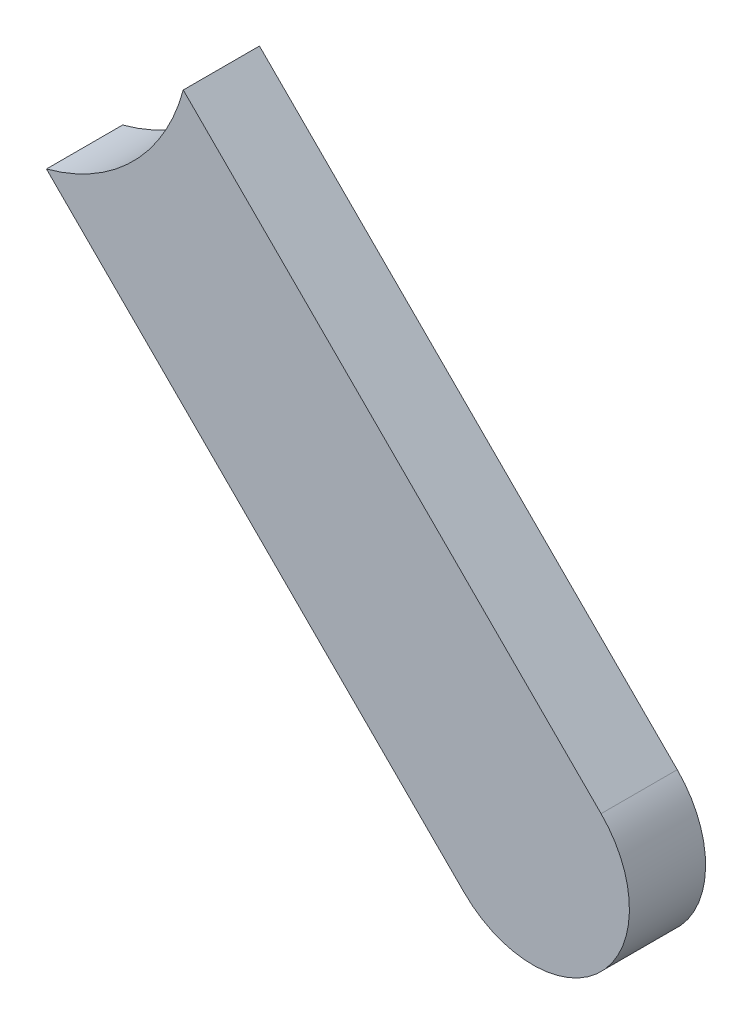
ISO-10303-21;
HEADER;
FILE_DESCRIPTION(('STEP AP214'),'2;1');
FILE_NAME('part.step','',(''),(''),'','','');
FILE_SCHEMA(('AUTOMOTIVE_DESIGN { 1 0 10303 214 1 1 1 1 }'));
ENDSEC;
DATA;
#1=APPLICATION_CONTEXT('core data for automotive mechanical design processes');
#2=APPLICATION_PROTOCOL_DEFINITION('international standard','automotive_design',2000,#1);
#3=PRODUCT_CONTEXT('',#1,'mechanical');
#4=PRODUCT('Part','Part','',(#3));
#5=PRODUCT_RELATED_PRODUCT_CATEGORY('part','',(#4));
#6=PRODUCT_DEFINITION_FORMATION('','',#4);
#7=PRODUCT_DEFINITION_CONTEXT('part definition',#1,'design');
#8=PRODUCT_DEFINITION('design','',#6,#7);
#9=PRODUCT_DEFINITION_SHAPE('','',#8);
#10=(LENGTH_UNIT() NAMED_UNIT(*) SI_UNIT(.MILLI.,.METRE.));
#11=(NAMED_UNIT(*) PLANE_ANGLE_UNIT() SI_UNIT($,.RADIAN.));
#12=(NAMED_UNIT(*) SI_UNIT($,.STERADIAN.) SOLID_ANGLE_UNIT());
#13=UNCERTAINTY_MEASURE_WITH_UNIT(LENGTH_MEASURE(1.E-05),#10,'distance_accuracy_value','');
#14=(GEOMETRIC_REPRESENTATION_CONTEXT(3) GLOBAL_UNCERTAINTY_ASSIGNED_CONTEXT((#13)) GLOBAL_UNIT_ASSIGNED_CONTEXT((#10,
#11,#12)) REPRESENTATION_CONTEXT('',''));
#15=CARTESIAN_POINT('',(0.,0.,0.));
#16=DIRECTION('',(0.,0.,1.));
#17=DIRECTION('',(1.,0.,0.));
#18=AXIS2_PLACEMENT_3D('',#15,#16,#17);
#19=CARTESIAN_POINT('',(106.176478785303,54.6638345346972,0.));
#20=DIRECTION('',(0.707106781186542,0.707106781186553,0.));
#21=DIRECTION('',(0.707106781186553,-0.707106781186542,0.));
#22=AXIS2_PLACEMENT_3D('',#19,#20,#21);
#23=PLANE('',#22);
#24=DIRECTION('',(0.707106781186553,-0.707106781186542,0.));
#25=VECTOR('',#24,1.);
#26=CARTESIAN_POINT('',(105.86539406,54.97491926,0.1999996));
#27=LINE('',#26,#25);
#28=CARTESIAN_POINT('',(106.176478785303,54.6638345346972,0.1999996));
#29=VERTEX_POINT('',#28);
#30=CARTESIAN_POINT('',(107.27351926,53.56679406,0.1999996));
#31=VERTEX_POINT('',#30);
#32=EDGE_CURVE('E11',#29,#31,#27,.T.);
#33=ORIENTED_EDGE('',*,*,#32,.F.);
#34=DIRECTION('',(0.,0.,1.));
#35=VECTOR('',#34,1.);
#36=CARTESIAN_POINT('',(106.176478785303,54.6638345346972,0.));
#37=LINE('',#36,#35);
#38=CARTESIAN_POINT('',(106.176478785303,54.6638345346972,0.));
#39=VERTEX_POINT('',#38);
#40=EDGE_CURVE('E24',#39,#29,#37,.T.);
#41=ORIENTED_EDGE('',*,*,#40,.F.);
#42=DIRECTION('',(0.707106781186553,-0.707106781186542,0.));
#43=VECTOR('',#42,1.);
#44=CARTESIAN_POINT('',(105.86539406,54.97491926,0.));
#45=LINE('',#44,#43);
#46=CARTESIAN_POINT('',(107.27351926,53.56679406,0.));
#47=VERTEX_POINT('',#46);
#48=EDGE_CURVE('E75',#39,#47,#45,.T.);
#49=ORIENTED_EDGE('',*,*,#48,.T.);
#50=DIRECTION('',(0.,0.,1.));
#51=VECTOR('',#50,1.);
#52=CARTESIAN_POINT('',(107.27351926,53.56679406,0.));
#53=LINE('',#52,#51);
#54=EDGE_CURVE('E37',#47,#31,#53,.T.);
#55=ORIENTED_EDGE('',*,*,#54,.T.);
#56=EDGE_LOOP('',(#33,#41,#49,#55));
#57=FACE_BOUND('',#56,.T.);
#58=ADVANCED_FACE('F17',(#57),#23,.F.);
#59=CARTESIAN_POINT('',(107.4531252,53.7464,0.));
#60=DIRECTION('',(0.,0.,-1.));
#61=DIRECTION('',(-0.707106781186548,-0.707106781186548,0.));
#62=AXIS2_PLACEMENT_3D('',#59,#60,#61);
#63=CYLINDRICAL_SURFACE('',#62,0.254001156230771);
#64=CARTESIAN_POINT('',(107.4531252,53.7464,0.1999996));
#65=DIRECTION('',(0.,0.,1.));
#66=DIRECTION('',(-0.707106781186548,-0.707106781186548,0.));
#67=AXIS2_PLACEMENT_3D('',#64,#65,#66);
#68=CIRCLE('',#67,0.254001156230771);
#69=CARTESIAN_POINT('',(107.63273114,53.92600594,0.1999996));
#70=VERTEX_POINT('',#69);
#71=EDGE_CURVE('E83',#31,#70,#68,.T.);
#72=ORIENTED_EDGE('',*,*,#71,.F.);
#73=ORIENTED_EDGE('',*,*,#54,.F.);
#74=CARTESIAN_POINT('',(107.4531252,53.7464,0.));
#75=DIRECTION('',(0.,0.,1.));
#76=DIRECTION('',(-0.707106781186548,-0.707106781186548,0.));
#77=AXIS2_PLACEMENT_3D('',#74,#75,#76);
#78=CIRCLE('',#77,0.254001156230771);
#79=CARTESIAN_POINT('',(107.63273114,53.92600594,0.));
#80=VERTEX_POINT('',#79);
#81=EDGE_CURVE('E81',#47,#80,#78,.T.);
#82=ORIENTED_EDGE('',*,*,#81,.T.);
#83=DIRECTION('',(0.,0.,1.));
#84=VECTOR('',#83,1.);
#85=CARTESIAN_POINT('',(107.63273114,53.92600594,0.));
#86=LINE('',#85,#84);
#87=EDGE_CURVE('E67',#80,#70,#86,.T.);
#88=ORIENTED_EDGE('',*,*,#87,.T.);
#89=EDGE_LOOP('',(#72,#73,#82,#88));
#90=FACE_BOUND('',#89,.T.);
#91=ADVANCED_FACE('F89',(#90),#63,.T.);
#92=CARTESIAN_POINT('',(107.63273114,53.92600594,0.));
#93=DIRECTION('',(-0.707106781186544,-0.707106781186551,0.));
#94=DIRECTION('',(-0.707106781186551,0.707106781186544,0.));
#95=AXIS2_PLACEMENT_3D('',#92,#93,#94);
#96=PLANE('',#95);
#97=DIRECTION('',(-0.707106781186551,0.707106781186544,0.));
#98=VECTOR('',#97,1.);
#99=CARTESIAN_POINT('',(107.63273114,53.92600594,0.1999996));
#100=LINE('',#99,#98);
#101=CARTESIAN_POINT('',(106.535690665303,55.0230464146972,0.1999996));
#102=VERTEX_POINT('',#101);
#103=EDGE_CURVE('E71',#70,#102,#100,.T.);
#104=ORIENTED_EDGE('',*,*,#103,.F.);
#105=ORIENTED_EDGE('',*,*,#87,.F.);
#106=DIRECTION('',(-0.707106781186551,0.707106781186544,0.));
#107=VECTOR('',#106,1.);
#108=CARTESIAN_POINT('',(107.63273114,53.92600594,0.));
#109=LINE('',#108,#107);
#110=CARTESIAN_POINT('',(106.535690665303,55.0230464146972,0.));
#111=VERTEX_POINT('',#110);
#112=EDGE_CURVE('E63',#80,#111,#109,.T.);
#113=ORIENTED_EDGE('',*,*,#112,.T.);
#114=DIRECTION('',(0.,0.,1.));
#115=VECTOR('',#114,1.);
#116=CARTESIAN_POINT('',(106.535690665303,55.0230464146972,0.));
#117=LINE('',#116,#115);
#118=EDGE_CURVE('E53',#111,#102,#117,.T.);
#119=ORIENTED_EDGE('',*,*,#118,.T.);
#120=EDGE_LOOP('',(#104,#105,#113,#119));
#121=FACE_BOUND('',#120,.T.);
#122=ADVANCED_FACE('F66',(#121),#96,.F.);
#123=CARTESIAN_POINT('',(106.045,55.1545252,0.));
#124=DIRECTION('',(0.,0.,-1.));
#125=DIRECTION('',(1.,0.,0.));
#126=AXIS2_PLACEMENT_3D('',#123,#124,#125);
#127=CYLINDRICAL_SURFACE('',#126,0.508);
#128=ORIENTED_EDGE('',*,*,#40,.T.);
#129=CARTESIAN_POINT('',(106.045,55.1545252,0.1999996));
#130=DIRECTION('',(0.,0.,1.));
#131=DIRECTION('',(1.,0.,0.));
#132=AXIS2_PLACEMENT_3D('',#129,#130,#131);
#133=CIRCLE('',#132,0.508);
#134=EDGE_CURVE('E59',#29,#102,#133,.T.);
#135=ORIENTED_EDGE('',*,*,#134,.T.);
#136=ORIENTED_EDGE('',*,*,#118,.F.);
#137=CARTESIAN_POINT('',(106.045,55.1545252,0.));
#138=DIRECTION('',(0.,0.,1.));
#139=DIRECTION('',(1.,0.,0.));
#140=AXIS2_PLACEMENT_3D('',#137,#138,#139);
#141=CIRCLE('',#140,0.508);
#142=EDGE_CURVE('E57',#39,#111,#141,.T.);
#143=ORIENTED_EDGE('',*,*,#142,.F.);
#144=EDGE_LOOP('',(#128,#135,#136,#143));
#145=FACE_BOUND('',#144,.T.);
#146=ADVANCED_FACE('F55',(#145),#127,.F.);
#147=CARTESIAN_POINT('',(105.86539406,54.97491926,0.));
#148=DIRECTION('',(0.,0.,-1.));
#149=DIRECTION('',(-1.,0.,0.));
#150=AXIS2_PLACEMENT_3D('',#147,#148,#149);
#151=PLANE('',#150);
#152=ORIENTED_EDGE('',*,*,#48,.F.);
#153=ORIENTED_EDGE('',*,*,#142,.T.);
#154=ORIENTED_EDGE('',*,*,#112,.F.);
#155=ORIENTED_EDGE('',*,*,#81,.F.);
#156=EDGE_LOOP('',(#152,#153,#154,#155));
#157=FACE_BOUND('',#156,.T.);
#158=ADVANCED_FACE('F74',(#157),#151,.T.);
#159=CARTESIAN_POINT('',(105.86539406,54.97491926,0.1999996));
#160=DIRECTION('',(0.,0.,-1.));
#161=DIRECTION('',(-1.,0.,0.));
#162=AXIS2_PLACEMENT_3D('',#159,#160,#161);
#163=PLANE('',#162);
#164=ORIENTED_EDGE('',*,*,#134,.F.);
#165=ORIENTED_EDGE('',*,*,#32,.T.);
#166=ORIENTED_EDGE('',*,*,#71,.T.);
#167=ORIENTED_EDGE('',*,*,#103,.T.);
#168=EDGE_LOOP('',(#164,#165,#166,#167));
#169=FACE_BOUND('',#168,.T.);
#170=ADVANCED_FACE('F91',(#169),#163,.F.);
#171=CLOSED_SHELL('',(#58,#91,#122,#146,#158,#170));
#172=MANIFOLD_SOLID_BREP('B1',#171);
#173=ADVANCED_BREP_SHAPE_REPRESENTATION('',(#18,#172),#14);
#174=SHAPE_DEFINITION_REPRESENTATION(#9,#173);
ENDSEC;
END-ISO-10303-21;
